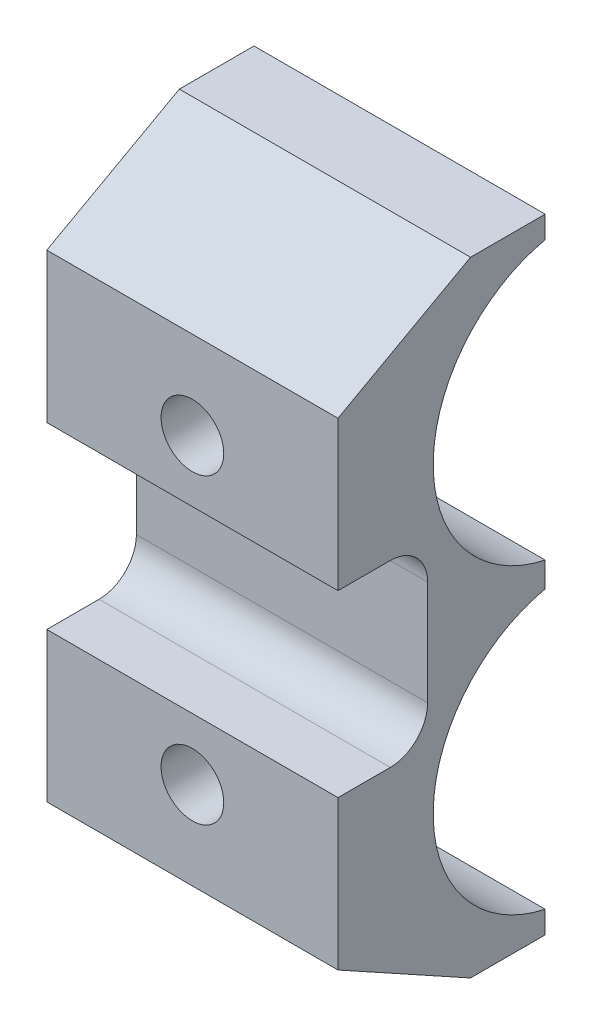
ISO-10303-21;
HEADER;
FILE_DESCRIPTION(('STEP AP214'),'2;1');
FILE_NAME('part.step','',(''),(''),'','','');
FILE_SCHEMA(('AUTOMOTIVE_DESIGN { 1 0 10303 214 1 1 1 1 }'));
ENDSEC;
DATA;
#1=APPLICATION_CONTEXT('core data for automotive mechanical design processes');
#2=APPLICATION_PROTOCOL_DEFINITION('international standard','automotive_design',2000,#1);
#3=PRODUCT_CONTEXT('',#1,'mechanical');
#4=PRODUCT('Part','Part','',(#3));
#5=PRODUCT_RELATED_PRODUCT_CATEGORY('part','',(#4));
#6=PRODUCT_DEFINITION_FORMATION('','',#4);
#7=PRODUCT_DEFINITION_CONTEXT('part definition',#1,'design');
#8=PRODUCT_DEFINITION('design','',#6,#7);
#9=PRODUCT_DEFINITION_SHAPE('','',#8);
#10=(LENGTH_UNIT() NAMED_UNIT(*) SI_UNIT(.MILLI.,.METRE.));
#11=(NAMED_UNIT(*) PLANE_ANGLE_UNIT() SI_UNIT($,.RADIAN.));
#12=(NAMED_UNIT(*) SI_UNIT($,.STERADIAN.) SOLID_ANGLE_UNIT());
#13=UNCERTAINTY_MEASURE_WITH_UNIT(LENGTH_MEASURE(1.E-05),#10,'distance_accuracy_value','');
#14=(GEOMETRIC_REPRESENTATION_CONTEXT(3) GLOBAL_UNCERTAINTY_ASSIGNED_CONTEXT((#13)) GLOBAL_UNIT_ASSIGNED_CONTEXT((#10,
#11,#12)) REPRESENTATION_CONTEXT('',''));
#15=CARTESIAN_POINT('',(0.,0.,0.));
#16=DIRECTION('',(0.,0.,1.));
#17=DIRECTION('',(1.,0.,0.));
#18=AXIS2_PLACEMENT_3D('',#15,#16,#17);
#19=CARTESIAN_POINT('',(9.75,-16.,15.875));
#20=DIRECTION('',(0.,0.,-1.));
#21=DIRECTION('',(-1.,0.,0.));
#22=AXIS2_PLACEMENT_3D('',#19,#20,#21);
#23=PLANE('',#22);
#24=CARTESIAN_POINT('',(0.,-10.125,15.875));
#25=DIRECTION('',(0.,0.,1.));
#26=DIRECTION('',(1.,0.,0.));
#27=AXIS2_PLACEMENT_3D('',#24,#25,#26);
#28=CIRCLE('',#27,2.1);
#29=CARTESIAN_POINT('',(2.1,-10.125,15.875));
#30=VERTEX_POINT('',#29);
#31=EDGE_CURVE('E253',#30,#30,#28,.T.);
#32=ORIENTED_EDGE('',*,*,#31,.F.);
#33=EDGE_LOOP('',(#32));
#34=FACE_BOUND('',#33,.T.);
#35=DIRECTION('',(0.,-1.,0.));
#36=VECTOR('',#35,1.);
#37=CARTESIAN_POINT('',(9.75,-16.,15.875));
#38=LINE('',#37,#36);
#39=CARTESIAN_POINT('',(9.75,-6.,15.875));
#40=VERTEX_POINT('',#39);
#41=CARTESIAN_POINT('',(9.75,-16.,15.875));
#42=VERTEX_POINT('',#41);
#43=EDGE_CURVE('E343',#40,#42,#38,.T.);
#44=ORIENTED_EDGE('',*,*,#43,.F.);
#45=DIRECTION('',(-1.,0.,0.));
#46=VECTOR('',#45,1.);
#47=CARTESIAN_POINT('',(9.75,-6.,15.875));
#48=LINE('',#47,#46);
#49=CARTESIAN_POINT('',(-9.75,-6.,15.875));
#50=VERTEX_POINT('',#49);
#51=EDGE_CURVE('E160',#40,#50,#48,.T.);
#52=ORIENTED_EDGE('',*,*,#51,.T.);
#53=DIRECTION('',(0.,-1.,0.));
#54=VECTOR('',#53,1.);
#55=CARTESIAN_POINT('',(-9.75,-16.,15.875));
#56=LINE('',#55,#54);
#57=CARTESIAN_POINT('',(-9.75,-16.,15.875));
#58=VERTEX_POINT('',#57);
#59=EDGE_CURVE('E155',#50,#58,#56,.T.);
#60=ORIENTED_EDGE('',*,*,#59,.T.);
#61=DIRECTION('',(-1.,0.,0.));
#62=VECTOR('',#61,1.);
#63=CARTESIAN_POINT('',(9.75,-16.,15.875));
#64=LINE('',#63,#62);
#65=EDGE_CURVE('E158',#42,#58,#64,.T.);
#66=ORIENTED_EDGE('',*,*,#65,.F.);
#67=EDGE_LOOP('',(#44,#52,#60,#66));
#68=FACE_BOUND('',#67,.T.);
#69=ADVANCED_FACE('F33',(#34,#68),#23,.F.);
#70=CARTESIAN_POINT('',(9.75,-16.,15.875));
#71=DIRECTION('',(0.,0.875433775843312,-0.483338084690955));
#72=DIRECTION('',(0.,0.483338084690956,0.875433775843313));
#73=AXIS2_PLACEMENT_3D('',#70,#71,#72);
#74=PLANE('',#73);
#75=DIRECTION('',(0.,-0.483338084690955,-0.875433775843312));
#76=VECTOR('',#75,1.);
#77=CARTESIAN_POINT('',(-9.75,-16.,15.875));
#78=LINE('',#77,#76);
#79=CARTESIAN_POINT('',(-9.75,-20.9,7.));
#80=VERTEX_POINT('',#79);
#81=EDGE_CURVE('E168',#58,#80,#78,.T.);
#82=ORIENTED_EDGE('',*,*,#81,.T.);
#83=DIRECTION('',(-1.,0.,0.));
#84=VECTOR('',#83,1.);
#85=CARTESIAN_POINT('',(9.75,-20.9,7.));
#86=LINE('',#85,#84);
#87=CARTESIAN_POINT('',(9.75,-20.9,7.));
#88=VERTEX_POINT('',#87);
#89=EDGE_CURVE('E222',#88,#80,#86,.T.);
#90=ORIENTED_EDGE('',*,*,#89,.F.);
#91=DIRECTION('',(0.,-0.483338084690955,-0.875433775843312));
#92=VECTOR('',#91,1.);
#93=CARTESIAN_POINT('',(9.75,-16.,15.875));
#94=LINE('',#93,#92);
#95=EDGE_CURVE('E170',#42,#88,#94,.T.);
#96=ORIENTED_EDGE('',*,*,#95,.F.);
#97=ORIENTED_EDGE('',*,*,#65,.T.);
#98=EDGE_LOOP('',(#82,#90,#96,#97));
#99=FACE_BOUND('',#98,.T.);
#100=ADVANCED_FACE('F35',(#99),#74,.F.);
#101=CARTESIAN_POINT('',(9.75,-20.9,7.));
#102=DIRECTION('',(0.,1.,0.));
#103=DIRECTION('',(0.,0.,1.));
#104=AXIS2_PLACEMENT_3D('',#101,#102,#103);
#105=PLANE('',#104);
#106=DIRECTION('',(0.,0.,-1.));
#107=VECTOR('',#106,1.);
#108=CARTESIAN_POINT('',(-9.75,-20.9,7.));
#109=LINE('',#108,#107);
#110=CARTESIAN_POINT('',(-9.75,-20.9,2.));
#111=VERTEX_POINT('',#110);
#112=EDGE_CURVE('E176',#80,#111,#109,.T.);
#113=ORIENTED_EDGE('',*,*,#112,.T.);
#114=DIRECTION('',(-1.,0.,0.));
#115=VECTOR('',#114,1.);
#116=CARTESIAN_POINT('',(9.75,-20.9,2.));
#117=LINE('',#116,#115);
#118=CARTESIAN_POINT('',(9.75,-20.9,2.));
#119=VERTEX_POINT('',#118);
#120=EDGE_CURVE('E219',#119,#111,#117,.T.);
#121=ORIENTED_EDGE('',*,*,#120,.F.);
#122=DIRECTION('',(0.,0.,-1.));
#123=VECTOR('',#122,1.);
#124=CARTESIAN_POINT('',(9.75,-20.9,7.));
#125=LINE('',#124,#123);
#126=EDGE_CURVE('E358',#88,#119,#125,.T.);
#127=ORIENTED_EDGE('',*,*,#126,.F.);
#128=ORIENTED_EDGE('',*,*,#89,.T.);
#129=EDGE_LOOP('',(#113,#121,#127,#128));
#130=FACE_BOUND('',#129,.T.);
#131=ADVANCED_FACE('F312',(#130),#105,.F.);
#132=CARTESIAN_POINT('',(9.75,-20.9,2.));
#133=DIRECTION('',(0.,0.,1.));
#134=DIRECTION('',(0.,-1.,0.));
#135=AXIS2_PLACEMENT_3D('',#132,#133,#134);
#136=PLANE('',#135);
#137=DIRECTION('',(0.,1.,0.));
#138=VECTOR('',#137,1.);
#139=CARTESIAN_POINT('',(-9.75,-20.9,2.));
#140=LINE('',#139,#138);
#141=CARTESIAN_POINT('',(-9.75,-19.4120878105034,2.));
#142=VERTEX_POINT('',#141);
#143=EDGE_CURVE('E180',#111,#142,#140,.T.);
#144=ORIENTED_EDGE('',*,*,#143,.T.);
#145=DIRECTION('',(-1.,0.,0.));
#146=VECTOR('',#145,1.);
#147=CARTESIAN_POINT('',(9.75,-19.4120878105034,2.));
#148=LINE('',#147,#146);
#149=CARTESIAN_POINT('',(9.75,-19.4120878105034,2.));
#150=VERTEX_POINT('',#149);
#151=EDGE_CURVE('E216',#150,#142,#148,.T.);
#152=ORIENTED_EDGE('',*,*,#151,.F.);
#153=DIRECTION('',(0.,1.,0.));
#154=VECTOR('',#153,1.);
#155=CARTESIAN_POINT('',(9.75,-20.9,2.));
#156=LINE('',#155,#154);
#157=EDGE_CURVE('E357',#119,#150,#156,.T.);
#158=ORIENTED_EDGE('',*,*,#157,.F.);
#159=ORIENTED_EDGE('',*,*,#120,.T.);
#160=EDGE_LOOP('',(#144,#152,#158,#159));
#161=FACE_BOUND('',#160,.T.);
#162=ADVANCED_FACE('F301',(#161),#136,.F.);
#163=CARTESIAN_POINT('',(9.75,-10.125,0.));
#164=DIRECTION('',(-1.,0.,0.));
#165=DIRECTION('',(0.,0.,1.));
#166=AXIS2_PLACEMENT_3D('',#163,#164,#165);
#167=CYLINDRICAL_SURFACE('',#166,9.5);
#168=CARTESIAN_POINT('',(2.1,-10.125,9.5));
#169=CARTESIAN_POINT('',(2.09999606715765,-10.0085596920723,9.49999785709729));
#170=CARTESIAN_POINT('',(2.09028277828364,-9.89207212984041,9.49783748384886));
#171=CARTESIAN_POINT('',(2.05172784260876,-9.66240789295682,9.4894280381436));
#172=CARTESIAN_POINT('',(2.02287272574585,-9.54923360845053,9.48317608649382));
#173=CARTESIAN_POINT('',(1.94698373436672,-9.32954806306881,9.46727932483978));
#174=CARTESIAN_POINT('',(1.89996905134314,-9.2230299054365,9.45763809767181));
#175=CARTESIAN_POINT('',(1.78915688551958,-9.01939697713897,9.43600237149338));
#176=CARTESIAN_POINT('',(1.72535976497756,-8.92228200356283,9.42400792327988));
#177=CARTESIAN_POINT('',(1.58168870929299,-8.73861907037091,9.39875937909973));
#178=CARTESIAN_POINT('',(1.50159262691729,-8.65224705725887,9.38548938349097));
#179=CARTESIAN_POINT('',(1.32807409975902,-8.49404770283157,9.35929692609845));
#180=CARTESIAN_POINT('',(1.23465044770762,-8.42222168058272,9.34637449592484));
#181=CARTESIAN_POINT('',(1.03582325817677,-8.29437332577055,9.32218329581774));
#182=CARTESIAN_POINT('',(0.930296152291522,-8.23853896708386,9.31093488695391));
#183=CARTESIAN_POINT('',(0.711067137800858,-8.14546484163014,9.29159379780658));
#184=CARTESIAN_POINT('',(0.597366231082767,-8.10822280037751,9.28350073154174));
#185=CARTESIAN_POINT('',(0.366927668155611,-8.05397328129699,9.27154869109911));
#186=CARTESIAN_POINT('',(0.250266884672186,-8.03665393691046,9.26762453435162));
#187=CARTESIAN_POINT('',(0.0156346151483341,-8.0217716103006,9.2642589010233));
#188=CARTESIAN_POINT('',(-0.102336704354329,-8.02420614587304,9.26481686123507));
#189=CARTESIAN_POINT('',(-0.333917866695424,-8.0485116506625,9.27029343657279));
#190=CARTESIAN_POINT('',(-0.44756801875287,-8.07001969057026,9.275130622727));
#191=CARTESIAN_POINT('',(-0.669605937040996,-8.13128640240636,9.28849180588077));
#192=CARTESIAN_POINT('',(-0.777993401983943,-8.17104611788024,9.2970160136854));
#193=CARTESIAN_POINT('',(-0.987446182906781,-8.2680190928007,9.31687062999741));
#194=CARTESIAN_POINT('',(-1.08844495272608,-8.3253713495681,9.32822324632103));
#195=CARTESIAN_POINT('',(-1.27951902636723,-8.45580369163111,9.35244198293865));
#196=CARTESIAN_POINT('',(-1.36959280835435,-8.52888596416974,9.3653083136002));
#197=CARTESIAN_POINT('',(-1.53834889007678,-8.69062207722818,9.39145369439784));
#198=CARTESIAN_POINT('',(-1.61673542548777,-8.77958437104705,9.40473558139056));
#199=CARTESIAN_POINT('',(-1.75752534135222,-8.96954292580126,9.42995676346728));
#200=CARTESIAN_POINT('',(-1.81992842014593,-9.07053941380822,9.44189603320935));
#201=CARTESIAN_POINT('',(-1.92705555482384,-9.28206470039705,9.46312681375453));
#202=CARTESIAN_POINT('',(-1.97174020742701,-9.39261408620509,9.47241241050783));
#203=CARTESIAN_POINT('',(-2.04181645968446,-9.61990343660546,9.48724573846241));
#204=CARTESIAN_POINT('',(-2.06721092622806,-9.73664247853697,9.49279402508532));
#205=CARTESIAN_POINT('',(-2.09755426397868,-9.97046095624298,9.49944831326327));
#206=CARTESIAN_POINT('',(-2.1029070612611,-10.0874855461996,9.50064206460397));
#207=CARTESIAN_POINT('',(-2.0941108495817,-10.3207568511187,9.4986989593362));
#208=CARTESIAN_POINT('',(-2.07996319314053,-10.4370036194677,9.495562403071));
#209=CARTESIAN_POINT('',(-2.03290249705699,-10.6640765497789,9.48536655052878));
#210=CARTESIAN_POINT('',(-2.00020191540127,-10.7749489158822,9.47835168931984));
#211=CARTESIAN_POINT('',(-1.91719991631618,-10.9896344886898,9.46118465966891));
#212=CARTESIAN_POINT('',(-1.8668969775111,-11.0934470842899,9.45103222005416));
#213=CARTESIAN_POINT('',(-1.7492807397568,-11.2927321025323,9.42850010733486));
#214=CARTESIAN_POINT('',(-1.68173092067501,-11.3880614403522,9.4160902184548));
#215=CARTESIAN_POINT('',(-1.53184921159322,-11.5661764808373,9.3904803693105));
#216=CARTESIAN_POINT('',(-1.44951535783065,-11.6489605144136,9.37728030424265));
#217=CARTESIAN_POINT('',(-1.2705474786429,-11.8012368046754,9.35127382345967));
#218=CARTESIAN_POINT('',(-1.17367313644392,-11.8704490763872,9.33847951939832));
#219=CARTESIAN_POINT('',(-0.969438808292507,-11.9916239008006,9.31501690397758));
#220=CARTESIAN_POINT('',(-0.862079279359842,-12.0435872049021,9.30434850001775));
#221=CARTESIAN_POINT('',(-0.640500516100298,-12.1284345252516,9.28644883260918));
#222=CARTESIAN_POINT('',(-0.526324316029969,-12.1614266238338,9.27919814138543));
#223=CARTESIAN_POINT('',(-0.293867326916637,-12.2077098961787,9.26892074912117));
#224=CARTESIAN_POINT('',(-0.1755872136829,-12.2210042980368,9.26589335596347));
#225=CARTESIAN_POINT('',(0.0588953606003005,-12.2273751375319,9.26444960483717));
#226=CARTESIAN_POINT('',(0.175085349730131,-12.2208957266634,9.26593194861283));
#227=CARTESIAN_POINT('',(0.404673806562934,-12.1888974557813,9.27311119600425));
#228=CARTESIAN_POINT('',(0.518072308611217,-12.1633788301396,9.27880804773963));
#229=CARTESIAN_POINT('',(0.738496894249019,-12.094243157095,9.29372452351939));
#230=CARTESIAN_POINT('',(0.845544591460207,-12.0506920640955,9.30293130025747));
#231=CARTESIAN_POINT('',(1.05087941131489,-11.946783886792,9.32383503234712));
#232=CARTESIAN_POINT('',(1.14916559738415,-11.8864250086329,9.33553225346652));
#233=CARTESIAN_POINT('',(1.33637393254247,-11.7491471513699,9.36040052943994));
#234=CARTESIAN_POINT('',(1.42506105616705,-11.6719122101185,9.37359701229712));
#235=CARTESIAN_POINT('',(1.58836150185076,-11.5037132764262,9.39980746067692));
#236=CARTESIAN_POINT('',(1.66297156179424,-11.4127461105498,9.41282138324922));
#237=CARTESIAN_POINT('',(1.79695225074567,-11.2182053117419,9.43740598211741));
#238=CARTESIAN_POINT('',(1.85610678389835,-11.1144799776431,9.44895513900801));
#239=CARTESIAN_POINT('',(1.95604768526871,-10.8983241338218,9.46909237502127));
#240=CARTESIAN_POINT('',(1.99684930443277,-10.7859009432624,9.47768291130886));
#241=CARTESIAN_POINT('',(2.05173818213111,-10.5819879294374,9.48942031323049));
#242=CARTESIAN_POINT('',(2.06980152400816,-10.4915930067546,9.49336293948738));
#243=CARTESIAN_POINT('',(2.09393371142421,-10.3091418562251,9.4986535703763));
#244=CARTESIAN_POINT('',(2.1000031102508,-10.2170857052095,9.50000169469413));
#245=CARTESIAN_POINT('',(2.1,-10.125,9.5));
#246=B_SPLINE_CURVE_WITH_KNOTS('',3,(#168,#169,#170,#171,#172,#173,#174,#175,#176,#177,#178,
#179,#180,#181,#182,#183,#184,#185,#186,#187,#188,#189,#190,#191,#192,#193,#194,#195,#196,#197,
#198,#199,#200,#201,#202,#203,#204,#205,#206,#207,#208,#209,#210,#211,#212,#213,#214,#215,#216,
#217,#218,#219,#220,#221,#222,#223,#224,#225,#226,#227,#228,#229,#230,#231,#232,#233,#234,#235,
#236,#237,#238,#239,#240,#241,#242,#243,#244,#245),.UNSPECIFIED.,.T.,.F.,(4,2,2,2,2,2,2,2,2,2,2,
2,2,2,2,2,2,2,2,2,2,2,2,2,2,2,2,2,2,2,2,2,2,2,2,2,2,2,4),(0.,0.348983826593803,
0.698213493210619,1.04707509039904,1.39592915783963,1.74990165295882,2.1039062328202,
2.46191554778973,2.81988105505783,3.17216332553392,3.52440133012415,3.87007743689001,
4.21577331026261,4.56427409671387,4.91282337319404,5.26907603377203,5.62533541749956,
5.98238268720982,6.3393768825031,6.68913613376488,7.03887112749838,7.38467972378605,
7.73051821577425,8.08138128733737,8.43229099854653,8.78981578433887,9.14732499358149,
9.50277669750311,9.85817014289103,10.2056400879585,10.5531057557594,10.8993116268792,
11.2455544619018,11.5989406758402,11.952408680602,12.3105821940723,12.6684575193393,
12.9444607773644,13.2204513029008),.UNSPECIFIED.);
#247=CARTESIAN_POINT('',(2.1,-10.125,9.5));
#248=VERTEX_POINT('',#247);
#249=EDGE_CURVE('E256',#248,#248,#246,.T.);
#250=ORIENTED_EDGE('',*,*,#249,.T.);
#251=EDGE_LOOP('',(#250));
#252=FACE_BOUND('',#251,.T.);
#253=CARTESIAN_POINT('',(-9.75,-10.125,0.));
#254=DIRECTION('',(-1.,0.,0.));
#255=DIRECTION('',(0.,0.,-1.));
#256=AXIS2_PLACEMENT_3D('',#253,#254,#255);
#257=CIRCLE('',#256,9.5);
#258=CARTESIAN_POINT('',(-9.75,-0.837912189496645,2.));
#259=VERTEX_POINT('',#258);
#260=EDGE_CURVE('E189',#142,#259,#257,.T.);
#261=ORIENTED_EDGE('',*,*,#260,.T.);
#262=DIRECTION('',(-1.,0.,0.));
#263=VECTOR('',#262,1.);
#264=CARTESIAN_POINT('',(9.75,-0.837912189496645,2.));
#265=LINE('',#264,#263);
#266=CARTESIAN_POINT('',(9.75,-0.837912189496645,2.));
#267=VERTEX_POINT('',#266);
#268=EDGE_CURVE('E213',#267,#259,#265,.T.);
#269=ORIENTED_EDGE('',*,*,#268,.F.);
#270=CARTESIAN_POINT('',(9.75,-10.125,0.));
#271=DIRECTION('',(-1.,0.,0.));
#272=DIRECTION('',(0.,0.,-1.));
#273=AXIS2_PLACEMENT_3D('',#270,#271,#272);
#274=CIRCLE('',#273,9.5);
#275=EDGE_CURVE('E355',#150,#267,#274,.T.);
#276=ORIENTED_EDGE('',*,*,#275,.F.);
#277=ORIENTED_EDGE('',*,*,#151,.T.);
#278=EDGE_LOOP('',(#261,#269,#276,#277));
#279=FACE_BOUND('',#278,.T.);
#280=ADVANCED_FACE('F263',(#252,#279),#167,.F.);
#281=CARTESIAN_POINT('',(9.75,-0.837912189496645,2.));
#282=DIRECTION('',(0.,0.,1.));
#283=DIRECTION('',(0.,-1.,0.));
#284=AXIS2_PLACEMENT_3D('',#281,#282,#283);
#285=PLANE('',#284);
#286=DIRECTION('',(0.,1.,0.));
#287=VECTOR('',#286,1.);
#288=CARTESIAN_POINT('',(-9.75,-0.837912189496645,2.));
#289=LINE('',#288,#287);
#290=CARTESIAN_POINT('',(-9.75,0.837912189496647,2.));
#291=VERTEX_POINT('',#290);
#292=EDGE_CURVE('E191',#259,#291,#289,.T.);
#293=ORIENTED_EDGE('',*,*,#292,.T.);
#294=DIRECTION('',(-1.,0.,0.));
#295=VECTOR('',#294,1.);
#296=CARTESIAN_POINT('',(9.75,0.837912189496647,2.));
#297=LINE('',#296,#295);
#298=CARTESIAN_POINT('',(9.75,0.837912189496647,2.));
#299=VERTEX_POINT('',#298);
#300=EDGE_CURVE('E210',#299,#291,#297,.T.);
#301=ORIENTED_EDGE('',*,*,#300,.F.);
#302=DIRECTION('',(0.,1.,0.));
#303=VECTOR('',#302,1.);
#304=CARTESIAN_POINT('',(9.75,-0.837912189496645,2.));
#305=LINE('',#304,#303);
#306=EDGE_CURVE('E353',#267,#299,#305,.T.);
#307=ORIENTED_EDGE('',*,*,#306,.F.);
#308=ORIENTED_EDGE('',*,*,#268,.T.);
#309=EDGE_LOOP('',(#293,#301,#307,#308));
#310=FACE_BOUND('',#309,.T.);
#311=ADVANCED_FACE('F293',(#310),#285,.F.);
#312=CARTESIAN_POINT('',(9.75,10.125,0.));
#313=DIRECTION('',(-1.,0.,0.));
#314=DIRECTION('',(0.,0.,1.));
#315=AXIS2_PLACEMENT_3D('',#312,#313,#314);
#316=CYLINDRICAL_SURFACE('',#315,9.5);
#317=CARTESIAN_POINT('',(2.1,10.125,9.5));
#318=CARTESIAN_POINT('',(2.09999606715765,10.2414403079277,9.49999785709729));
#319=CARTESIAN_POINT('',(2.09028277828364,10.3579278701596,9.49783748384886));
#320=CARTESIAN_POINT('',(2.05172784260876,10.5875921070432,9.4894280381436));
#321=CARTESIAN_POINT('',(2.02287272574585,10.7007663915495,9.48317608649382));
#322=CARTESIAN_POINT('',(1.94698373436672,10.9204519369312,9.46727932483978));
#323=CARTESIAN_POINT('',(1.89996905134314,11.0269700945635,9.45763809767181));
#324=CARTESIAN_POINT('',(1.78915688551958,11.230603022861,9.43600237149338));
#325=CARTESIAN_POINT('',(1.72535976497756,11.3277179964372,9.42400792327988));
#326=CARTESIAN_POINT('',(1.58168870929299,11.5113809296291,9.39875937909973));
#327=CARTESIAN_POINT('',(1.50159262691729,11.5977529427411,9.38548938349097));
#328=CARTESIAN_POINT('',(1.32807409975902,11.7559522971684,9.35929692609845));
#329=CARTESIAN_POINT('',(1.23465044770763,11.8277783194173,9.34637449592484));
#330=CARTESIAN_POINT('',(1.03582325817677,11.9556266742295,9.32218329581774));
#331=CARTESIAN_POINT('',(0.930296152291523,12.0114610329161,9.31093488695391));
#332=CARTESIAN_POINT('',(0.711067137800858,12.1045351583699,9.29159379780658));
#333=CARTESIAN_POINT('',(0.597366231082767,12.1417771996225,9.28350073154174));
#334=CARTESIAN_POINT('',(0.366927668155611,12.196026718703,9.27154869109911));
#335=CARTESIAN_POINT('',(0.250266884672186,12.2133460630895,9.26762453435162));
#336=CARTESIAN_POINT('',(0.0156346151483341,12.2282283896994,9.2642589010233));
#337=CARTESIAN_POINT('',(-0.102336704354329,12.225793854127,9.26481686123507));
#338=CARTESIAN_POINT('',(-0.333917866695424,12.2014883493375,9.27029343657279));
#339=CARTESIAN_POINT('',(-0.44756801875287,12.1799803094297,9.275130622727));
#340=CARTESIAN_POINT('',(-0.669605937040996,12.1187135975936,9.28849180588077));
#341=CARTESIAN_POINT('',(-0.777993401983943,12.0789538821198,9.2970160136854));
#342=CARTESIAN_POINT('',(-0.987446182906781,11.9819809071993,9.31687062999741));
#343=CARTESIAN_POINT('',(-1.08844495272608,11.9246286504319,9.32822324632103));
#344=CARTESIAN_POINT('',(-1.27951902636723,11.7941963083689,9.35244198293865));
#345=CARTESIAN_POINT('',(-1.36959280835435,11.7211140358303,9.3653083136002));
#346=CARTESIAN_POINT('',(-1.53834889007678,11.5593779227718,9.39145369439784));
#347=CARTESIAN_POINT('',(-1.61673542548777,11.4704156289529,9.40473558139056));
#348=CARTESIAN_POINT('',(-1.75752534135222,11.2804570741987,9.42995676346728));
#349=CARTESIAN_POINT('',(-1.81992842014593,11.1794605861918,9.44189603320935));
#350=CARTESIAN_POINT('',(-1.92705555482384,10.9679352996029,9.46312681375453));
#351=CARTESIAN_POINT('',(-1.97174020742701,10.8573859137949,9.47241241050783));
#352=CARTESIAN_POINT('',(-2.04181645968446,10.6300965633945,9.48724573846241));
#353=CARTESIAN_POINT('',(-2.06721092622806,10.513357521463,9.49279402508532));
#354=CARTESIAN_POINT('',(-2.09755426397868,10.279539043757,9.49944831326327));
#355=CARTESIAN_POINT('',(-2.1029070612611,10.1625144538004,9.50064206460397));
#356=CARTESIAN_POINT('',(-2.0941108495817,9.92924314888132,9.4986989593362));
#357=CARTESIAN_POINT('',(-2.07996319314053,9.81299638053234,9.495562403071));
#358=CARTESIAN_POINT('',(-2.03290249705699,9.58592345022112,9.48536655052878));
#359=CARTESIAN_POINT('',(-2.00020191540127,9.4750510841178,9.47835168931984));
#360=CARTESIAN_POINT('',(-1.91719991631618,9.2603655113102,9.46118465966891));
#361=CARTESIAN_POINT('',(-1.8668969775111,9.15655291571006,9.45103222005416));
#362=CARTESIAN_POINT('',(-1.7492807397568,8.95726789746768,9.42850010733486));
#363=CARTESIAN_POINT('',(-1.68173092067501,8.86193855964783,9.4160902184548));
#364=CARTESIAN_POINT('',(-1.53184921159322,8.68382351916267,9.3904803693105));
#365=CARTESIAN_POINT('',(-1.44951535783065,8.60103948558644,9.37728030424265));
#366=CARTESIAN_POINT('',(-1.2705474786429,8.4487631953246,9.35127382345967));
#367=CARTESIAN_POINT('',(-1.17367313644392,8.37955092361276,9.33847951939832));
#368=CARTESIAN_POINT('',(-0.969438808292507,8.25837609919942,9.31501690397758));
#369=CARTESIAN_POINT('',(-0.862079279359842,8.20641279509788,9.30434850001775));
#370=CARTESIAN_POINT('',(-0.640500516100298,8.12156547474838,9.28644883260918));
#371=CARTESIAN_POINT('',(-0.526324316029969,8.0885733761662,9.27919814138543));
#372=CARTESIAN_POINT('',(-0.293867326916637,8.04229010382126,9.26892074912117));
#373=CARTESIAN_POINT('',(-0.1755872136829,8.02899570196322,9.26589335596347));
#374=CARTESIAN_POINT('',(0.0588953606003005,8.02262486246806,9.26444960483717));
#375=CARTESIAN_POINT('',(0.175085349730132,8.02910427333659,9.26593194861283));
#376=CARTESIAN_POINT('',(0.404673806562934,8.06110254421865,9.27311119600425));
#377=CARTESIAN_POINT('',(0.518072308611217,8.08662116986044,9.27880804773963));
#378=CARTESIAN_POINT('',(0.73849689424902,8.15575684290503,9.29372452351939));
#379=CARTESIAN_POINT('',(0.845544591460208,8.19930793590452,9.30293130025747));
#380=CARTESIAN_POINT('',(1.05087941131489,8.303216113208,9.32383503234712));
#381=CARTESIAN_POINT('',(1.14916559738415,8.36357499136707,9.33553225346652));
#382=CARTESIAN_POINT('',(1.33637393254247,8.50085284863007,9.36040052943994));
#383=CARTESIAN_POINT('',(1.42506105616705,8.57808778988145,9.37359701229712));
#384=CARTESIAN_POINT('',(1.58836150185076,8.74628672357381,9.39980746067692));
#385=CARTESIAN_POINT('',(1.66297156179424,8.83725388945017,9.41282138324922));
#386=CARTESIAN_POINT('',(1.79695225074567,9.03179468825808,9.43740598211741));
#387=CARTESIAN_POINT('',(1.85610678389835,9.13552002235687,9.44895513900801));
#388=CARTESIAN_POINT('',(1.95604768526871,9.3516758661782,9.46909237502127));
#389=CARTESIAN_POINT('',(1.99684930443277,9.46409905673758,9.47768291130886));
#390=CARTESIAN_POINT('',(2.05173818213111,9.66801207056256,9.48942031323049));
#391=CARTESIAN_POINT('',(2.06980152400816,9.7584069932454,9.49336293948738));
#392=CARTESIAN_POINT('',(2.09393371142421,9.94085814377495,9.4986535703763));
#393=CARTESIAN_POINT('',(2.1000031102508,10.0329142947905,9.50000169469413));
#394=CARTESIAN_POINT('',(2.1,10.125,9.5));
#395=B_SPLINE_CURVE_WITH_KNOTS('',3,(#317,#318,#319,#320,#321,#322,#323,#324,#325,#326,#327,
#328,#329,#330,#331,#332,#333,#334,#335,#336,#337,#338,#339,#340,#341,#342,#343,#344,#345,#346,
#347,#348,#349,#350,#351,#352,#353,#354,#355,#356,#357,#358,#359,#360,#361,#362,#363,#364,#365,
#366,#367,#368,#369,#370,#371,#372,#373,#374,#375,#376,#377,#378,#379,#380,#381,#382,#383,#384,
#385,#386,#387,#388,#389,#390,#391,#392,#393,#394),.UNSPECIFIED.,.T.,.F.,(4,2,2,2,2,2,2,2,2,2,2,
2,2,2,2,2,2,2,2,2,2,2,2,2,2,2,2,2,2,2,2,2,2,2,2,2,2,2,4),(0.,0.348983826593803,
0.698213493210619,1.04707509039903,1.39592915783963,1.74990165295882,2.1039062328202,
2.46191554778973,2.81988105505783,3.17216332553392,3.52440133012415,3.87007743689001,
4.21577331026261,4.56427409671387,4.91282337319404,5.26907603377203,5.62533541749956,
5.98238268720982,6.3393768825031,6.68913613376488,7.03887112749838,7.38467972378605,
7.73051821577425,8.08138128733737,8.43229099854653,8.78981578433887,9.14732499358149,
9.50277669750311,9.85817014289103,10.2056400879585,10.5531057557594,10.8993116268792,
11.2455544619018,11.5989406758403,11.952408680602,12.3105821940723,12.6684575193393,
12.9444607773644,13.2204513029008),.UNSPECIFIED.);
#396=CARTESIAN_POINT('',(2.1,10.125,9.5));
#397=VERTEX_POINT('',#396);
#398=EDGE_CURVE('E178',#397,#397,#395,.T.);
#399=ORIENTED_EDGE('',*,*,#398,.T.);
#400=EDGE_LOOP('',(#399));
#401=FACE_BOUND('',#400,.T.);
#402=CARTESIAN_POINT('',(-9.75,10.125,0.));
#403=DIRECTION('',(-1.,0.,0.));
#404=DIRECTION('',(0.,0.,-1.));
#405=AXIS2_PLACEMENT_3D('',#402,#403,#404);
#406=CIRCLE('',#405,9.5);
#407=CARTESIAN_POINT('',(-9.75,19.4120878105034,2.));
#408=VERTEX_POINT('',#407);
#409=EDGE_CURVE('E193',#291,#408,#406,.T.);
#410=ORIENTED_EDGE('',*,*,#409,.T.);
#411=DIRECTION('',(-1.,0.,0.));
#412=VECTOR('',#411,1.);
#413=CARTESIAN_POINT('',(9.75,19.4120878105034,2.));
#414=LINE('',#413,#412);
#415=CARTESIAN_POINT('',(9.75,19.4120878105034,2.));
#416=VERTEX_POINT('',#415);
#417=EDGE_CURVE('E207',#416,#408,#414,.T.);
#418=ORIENTED_EDGE('',*,*,#417,.F.);
#419=CARTESIAN_POINT('',(9.75,10.125,0.));
#420=DIRECTION('',(-1.,0.,0.));
#421=DIRECTION('',(0.,0.,-1.));
#422=AXIS2_PLACEMENT_3D('',#419,#420,#421);
#423=CIRCLE('',#422,9.5);
#424=EDGE_CURVE('E351',#299,#416,#423,.T.);
#425=ORIENTED_EDGE('',*,*,#424,.F.);
#426=ORIENTED_EDGE('',*,*,#300,.T.);
#427=EDGE_LOOP('',(#410,#418,#425,#426));
#428=FACE_BOUND('',#427,.T.);
#429=ADVANCED_FACE('F288',(#401,#428),#316,.F.);
#430=CARTESIAN_POINT('',(9.75,19.4120878105034,2.));
#431=DIRECTION('',(0.,0.,1.));
#432=DIRECTION('',(0.,-1.,0.));
#433=AXIS2_PLACEMENT_3D('',#430,#431,#432);
#434=PLANE('',#433);
#435=DIRECTION('',(0.,1.,0.));
#436=VECTOR('',#435,1.);
#437=CARTESIAN_POINT('',(-9.75,19.4120878105034,2.));
#438=LINE('',#437,#436);
#439=CARTESIAN_POINT('',(-9.75,20.9,2.));
#440=VERTEX_POINT('',#439);
#441=EDGE_CURVE('E195',#408,#440,#438,.T.);
#442=ORIENTED_EDGE('',*,*,#441,.T.);
#443=DIRECTION('',(-1.,0.,0.));
#444=VECTOR('',#443,1.);
#445=CARTESIAN_POINT('',(9.75,20.9,2.));
#446=LINE('',#445,#444);
#447=CARTESIAN_POINT('',(9.75,20.9,2.));
#448=VERTEX_POINT('',#447);
#449=EDGE_CURVE('E204',#448,#440,#446,.T.);
#450=ORIENTED_EDGE('',*,*,#449,.F.);
#451=DIRECTION('',(0.,1.,0.));
#452=VECTOR('',#451,1.);
#453=CARTESIAN_POINT('',(9.75,19.4120878105034,2.));
#454=LINE('',#453,#452);
#455=EDGE_CURVE('E347',#416,#448,#454,.T.);
#456=ORIENTED_EDGE('',*,*,#455,.F.);
#457=ORIENTED_EDGE('',*,*,#417,.T.);
#458=EDGE_LOOP('',(#442,#450,#456,#457));
#459=FACE_BOUND('',#458,.T.);
#460=ADVANCED_FACE('F292',(#459),#434,.F.);
#461=CARTESIAN_POINT('',(9.75,20.9,7.));
#462=DIRECTION('',(0.,-1.,0.));
#463=DIRECTION('',(0.,0.,-1.));
#464=AXIS2_PLACEMENT_3D('',#461,#462,#463);
#465=PLANE('',#464);
#466=DIRECTION('',(0.,0.,1.));
#467=VECTOR('',#466,1.);
#468=CARTESIAN_POINT('',(-9.75,20.9,7.));
#469=LINE('',#468,#467);
#470=CARTESIAN_POINT('',(-9.75,20.9,7.));
#471=VERTEX_POINT('',#470);
#472=EDGE_CURVE('E197',#440,#471,#469,.T.);
#473=ORIENTED_EDGE('',*,*,#472,.T.);
#474=DIRECTION('',(-1.,0.,0.));
#475=VECTOR('',#474,1.);
#476=CARTESIAN_POINT('',(9.75,20.9,7.));
#477=LINE('',#476,#475);
#478=CARTESIAN_POINT('',(9.75,20.9,7.));
#479=VERTEX_POINT('',#478);
#480=EDGE_CURVE('E202',#479,#471,#477,.T.);
#481=ORIENTED_EDGE('',*,*,#480,.F.);
#482=DIRECTION('',(0.,0.,1.));
#483=VECTOR('',#482,1.);
#484=CARTESIAN_POINT('',(9.75,20.9,7.));
#485=LINE('',#484,#483);
#486=EDGE_CURVE('E345',#448,#479,#485,.T.);
#487=ORIENTED_EDGE('',*,*,#486,.F.);
#488=ORIENTED_EDGE('',*,*,#449,.T.);
#489=EDGE_LOOP('',(#473,#481,#487,#488));
#490=FACE_BOUND('',#489,.T.);
#491=ADVANCED_FACE('F322',(#490),#465,.F.);
#492=CARTESIAN_POINT('',(9.75,16.,15.875));
#493=DIRECTION('',(0.,-0.875433775843312,-0.483338084690955));
#494=DIRECTION('',(0.,0.483338084690956,-0.875433775843313));
#495=AXIS2_PLACEMENT_3D('',#492,#493,#494);
#496=PLANE('',#495);
#497=DIRECTION('',(0.,-0.483338084690955,0.875433775843312));
#498=VECTOR('',#497,1.);
#499=CARTESIAN_POINT('',(-9.75,16.,15.875));
#500=LINE('',#499,#498);
#501=CARTESIAN_POINT('',(-9.75,16.,15.875));
#502=VERTEX_POINT('',#501);
#503=EDGE_CURVE('E148',#471,#502,#500,.T.);
#504=ORIENTED_EDGE('',*,*,#503,.T.);
#505=DIRECTION('',(-1.,0.,0.));
#506=VECTOR('',#505,1.);
#507=CARTESIAN_POINT('',(9.75,16.,15.875));
#508=LINE('',#507,#506);
#509=CARTESIAN_POINT('',(9.75,16.,15.875));
#510=VERTEX_POINT('',#509);
#511=EDGE_CURVE('E171',#510,#502,#508,.T.);
#512=ORIENTED_EDGE('',*,*,#511,.F.);
#513=DIRECTION('',(0.,-0.483338084690955,0.875433775843312));
#514=VECTOR('',#513,1.);
#515=CARTESIAN_POINT('',(9.75,16.,15.875));
#516=LINE('',#515,#514);
#517=EDGE_CURVE('E344',#479,#510,#516,.T.);
#518=ORIENTED_EDGE('',*,*,#517,.F.);
#519=ORIENTED_EDGE('',*,*,#480,.T.);
#520=EDGE_LOOP('',(#504,#512,#518,#519));
#521=FACE_BOUND('',#520,.T.);
#522=ADVANCED_FACE('F315',(#521),#496,.F.);
#523=CARTESIAN_POINT('',(0.,10.125,15.875));
#524=DIRECTION('',(0.,0.,1.));
#525=DIRECTION('',(1.,0.,0.));
#526=AXIS2_PLACEMENT_3D('',#523,#524,#525);
#527=CIRCLE('',#526,2.1);
#528=CARTESIAN_POINT('',(2.1,10.125,15.875));
#529=VERTEX_POINT('',#528);
#530=EDGE_CURVE('E183',#529,#529,#527,.T.);
#531=ORIENTED_EDGE('',*,*,#530,.F.);
#532=EDGE_LOOP('',(#531));
#533=FACE_BOUND('',#532,.T.);
#534=CARTESIAN_POINT('',(-9.75,6.00000000000001,15.875));
#535=VERTEX_POINT('',#534);
#536=EDGE_CURVE('E163',#502,#535,#56,.T.);
#537=ORIENTED_EDGE('',*,*,#536,.T.);
#538=DIRECTION('',(-1.,0.,0.));
#539=VECTOR('',#538,1.);
#540=CARTESIAN_POINT('',(9.75,6.,15.875));
#541=LINE('',#540,#539);
#542=CARTESIAN_POINT('',(9.75,6.,15.875));
#543=VERTEX_POINT('',#542);
#544=EDGE_CURVE('E51',#543,#535,#541,.T.);
#545=ORIENTED_EDGE('',*,*,#544,.F.);
#546=EDGE_CURVE('E172',#510,#543,#38,.T.);
#547=ORIENTED_EDGE('',*,*,#546,.F.);
#548=ORIENTED_EDGE('',*,*,#511,.T.);
#549=EDGE_LOOP('',(#537,#545,#547,#548));
#550=FACE_BOUND('',#549,.T.);
#551=ADVANCED_FACE('F306',(#533,#550),#23,.F.);
#552=CARTESIAN_POINT('',(9.75,-10.125,0.));
#553=DIRECTION('',(1.,0.,0.));
#554=DIRECTION('',(0.,0.,-1.));
#555=AXIS2_PLACEMENT_3D('',#552,#553,#554);
#556=PLANE('',#555);
#557=DIRECTION('',(0.,0.,1.));
#558=VECTOR('',#557,1.);
#559=CARTESIAN_POINT('',(9.75,-6.,15.875));
#560=LINE('',#559,#558);
#561=CARTESIAN_POINT('',(9.75,-6.,12.375));
#562=VERTEX_POINT('',#561);
#563=EDGE_CURVE('E342',#562,#40,#560,.T.);
#564=ORIENTED_EDGE('',*,*,#563,.T.);
#565=ORIENTED_EDGE('',*,*,#43,.T.);
#566=ORIENTED_EDGE('',*,*,#95,.T.);
#567=ORIENTED_EDGE('',*,*,#126,.T.);
#568=ORIENTED_EDGE('',*,*,#157,.T.);
#569=ORIENTED_EDGE('',*,*,#275,.T.);
#570=ORIENTED_EDGE('',*,*,#306,.T.);
#571=ORIENTED_EDGE('',*,*,#424,.T.);
#572=ORIENTED_EDGE('',*,*,#455,.T.);
#573=ORIENTED_EDGE('',*,*,#486,.T.);
#574=ORIENTED_EDGE('',*,*,#517,.T.);
#575=ORIENTED_EDGE('',*,*,#546,.T.);
#576=DIRECTION('',(0.,0.,-1.));
#577=VECTOR('',#576,1.);
#578=CARTESIAN_POINT('',(9.75,6.,15.875));
#579=LINE('',#578,#577);
#580=CARTESIAN_POINT('',(9.75,6.,12.375));
#581=VERTEX_POINT('',#580);
#582=EDGE_CURVE('E78',#543,#581,#579,.T.);
#583=ORIENTED_EDGE('',*,*,#582,.T.);
#584=CARTESIAN_POINT('',(9.75,3.5,12.375));
#585=DIRECTION('',(-1.,0.,0.));
#586=DIRECTION('',(0.,0.,1.));
#587=AXIS2_PLACEMENT_3D('',#584,#585,#586);
#588=CIRCLE('',#587,2.5);
#589=CARTESIAN_POINT('',(9.75,3.5,9.875));
#590=VERTEX_POINT('',#589);
#591=EDGE_CURVE('E334',#581,#590,#588,.T.);
#592=ORIENTED_EDGE('',*,*,#591,.T.);
#593=DIRECTION('',(0.,-1.,0.));
#594=VECTOR('',#593,1.);
#595=CARTESIAN_POINT('',(9.75,3.5,9.87500000000001));
#596=LINE('',#595,#594);
#597=CARTESIAN_POINT('',(9.75,-3.5,9.87500000000001));
#598=VERTEX_POINT('',#597);
#599=EDGE_CURVE('E335',#590,#598,#596,.T.);
#600=ORIENTED_EDGE('',*,*,#599,.T.);
#601=CARTESIAN_POINT('',(9.75,-3.5,12.375));
#602=DIRECTION('',(-1.,0.,0.));
#603=DIRECTION('',(0.,0.,-1.));
#604=AXIS2_PLACEMENT_3D('',#601,#602,#603);
#605=CIRCLE('',#604,2.5);
#606=EDGE_CURVE('E238',#598,#562,#605,.T.);
#607=ORIENTED_EDGE('',*,*,#606,.T.);
#608=EDGE_LOOP('',(#564,#565,#566,#567,#568,#569,#570,#571,#572,#573,#574,#575,#583,#592,#600,#607));
#609=FACE_BOUND('',#608,.T.);
#610=ADVANCED_FACE('F281',(#609),#556,.T.);
#611=CARTESIAN_POINT('',(-9.75,-10.125,0.));
#612=DIRECTION('',(1.,0.,0.));
#613=DIRECTION('',(0.,0.,-1.));
#614=AXIS2_PLACEMENT_3D('',#611,#612,#613);
#615=PLANE('',#614);
#616=ORIENTED_EDGE('',*,*,#59,.F.);
#617=DIRECTION('',(0.,0.,-1.));
#618=VECTOR('',#617,1.);
#619=CARTESIAN_POINT('',(-9.75,-6.00000000000002,0.));
#620=LINE('',#619,#618);
#621=CARTESIAN_POINT('',(-9.75,-6.,12.375));
#622=VERTEX_POINT('',#621);
#623=EDGE_CURVE('E11',#50,#622,#620,.T.);
#624=ORIENTED_EDGE('',*,*,#623,.T.);
#625=CARTESIAN_POINT('',(-9.75,-3.5,12.375));
#626=DIRECTION('',(-1.,0.,0.));
#627=DIRECTION('',(0.,0.,1.));
#628=AXIS2_PLACEMENT_3D('',#625,#626,#627);
#629=CIRCLE('',#628,2.5);
#630=CARTESIAN_POINT('',(-9.75,-3.5,9.87500000000001));
#631=VERTEX_POINT('',#630);
#632=EDGE_CURVE('E37',#622,#631,#629,.F.);
#633=ORIENTED_EDGE('',*,*,#632,.T.);
#634=DIRECTION('',(0.,1.,0.));
#635=VECTOR('',#634,1.);
#636=CARTESIAN_POINT('',(-9.75,-10.125,9.87500000000001));
#637=LINE('',#636,#635);
#638=CARTESIAN_POINT('',(-9.75,3.5,9.87500000000001));
#639=VERTEX_POINT('',#638);
#640=EDGE_CURVE('E228',#631,#639,#637,.T.);
#641=ORIENTED_EDGE('',*,*,#640,.T.);
#642=CARTESIAN_POINT('',(-9.75,3.5,12.375));
#643=DIRECTION('',(-1.,0.,0.));
#644=DIRECTION('',(0.,0.,1.));
#645=AXIS2_PLACEMENT_3D('',#642,#643,#644);
#646=CIRCLE('',#645,2.5);
#647=CARTESIAN_POINT('',(-9.75,6.,12.375));
#648=VERTEX_POINT('',#647);
#649=EDGE_CURVE('E225',#639,#648,#646,.F.);
#650=ORIENTED_EDGE('',*,*,#649,.T.);
#651=DIRECTION('',(0.,0.,1.));
#652=VECTOR('',#651,1.);
#653=CARTESIAN_POINT('',(-9.75,6.00000000000002,0.));
#654=LINE('',#653,#652);
#655=EDGE_CURVE('E224',#648,#535,#654,.T.);
#656=ORIENTED_EDGE('',*,*,#655,.T.);
#657=ORIENTED_EDGE('',*,*,#536,.F.);
#658=ORIENTED_EDGE('',*,*,#503,.F.);
#659=ORIENTED_EDGE('',*,*,#472,.F.);
#660=ORIENTED_EDGE('',*,*,#441,.F.);
#661=ORIENTED_EDGE('',*,*,#409,.F.);
#662=ORIENTED_EDGE('',*,*,#292,.F.);
#663=ORIENTED_EDGE('',*,*,#260,.F.);
#664=ORIENTED_EDGE('',*,*,#143,.F.);
#665=ORIENTED_EDGE('',*,*,#112,.F.);
#666=ORIENTED_EDGE('',*,*,#81,.F.);
#667=EDGE_LOOP('',(#616,#624,#633,#641,#650,#656,#657,#658,#659,#660,#661,#662,#663,#664,#665,#666));
#668=FACE_BOUND('',#667,.T.);
#669=ADVANCED_FACE('F174',(#668),#615,.F.);
#670=CARTESIAN_POINT('',(0.,10.125,2.));
#671=DIRECTION('',(0.,0.,1.));
#672=DIRECTION('',(1.,0.,0.));
#673=AXIS2_PLACEMENT_3D('',#670,#671,#672);
#674=CYLINDRICAL_SURFACE('',#673,2.1);
#675=ORIENTED_EDGE('',*,*,#530,.T.);
#676=EDGE_LOOP('',(#675));
#677=FACE_BOUND('',#676,.T.);
#678=ORIENTED_EDGE('',*,*,#398,.F.);
#679=EDGE_LOOP('',(#678));
#680=FACE_BOUND('',#679,.T.);
#681=ADVANCED_FACE('F273',(#677,#680),#674,.F.);
#682=CARTESIAN_POINT('',(0.,-10.125,2.));
#683=DIRECTION('',(0.,0.,1.));
#684=DIRECTION('',(1.,0.,0.));
#685=AXIS2_PLACEMENT_3D('',#682,#683,#684);
#686=CYLINDRICAL_SURFACE('',#685,2.1);
#687=ORIENTED_EDGE('',*,*,#31,.T.);
#688=EDGE_LOOP('',(#687));
#689=FACE_BOUND('',#688,.T.);
#690=ORIENTED_EDGE('',*,*,#249,.F.);
#691=EDGE_LOOP('',(#690));
#692=FACE_BOUND('',#691,.T.);
#693=ADVANCED_FACE('F267',(#689,#692),#686,.F.);
#694=CARTESIAN_POINT('',(9.75,-6.,15.875));
#695=DIRECTION('',(0.,-1.,0.));
#696=DIRECTION('',(0.,0.,-1.));
#697=AXIS2_PLACEMENT_3D('',#694,#695,#696);
#698=PLANE('',#697);
#699=ORIENTED_EDGE('',*,*,#51,.F.);
#700=ORIENTED_EDGE('',*,*,#563,.F.);
#701=DIRECTION('',(-1.,0.,0.));
#702=VECTOR('',#701,1.);
#703=CARTESIAN_POINT('',(9.75,-6.,12.375));
#704=LINE('',#703,#702);
#705=EDGE_CURVE('E72',#562,#622,#704,.T.);
#706=ORIENTED_EDGE('',*,*,#705,.T.);
#707=ORIENTED_EDGE('',*,*,#623,.F.);
#708=EDGE_LOOP('',(#699,#700,#706,#707));
#709=FACE_BOUND('',#708,.T.);
#710=ADVANCED_FACE('F272',(#709),#698,.F.);
#711=CARTESIAN_POINT('',(9.75,-3.5,12.375));
#712=DIRECTION('',(-1.,0.,0.));
#713=DIRECTION('',(0.,0.,1.));
#714=AXIS2_PLACEMENT_3D('',#711,#712,#713);
#715=CYLINDRICAL_SURFACE('',#714,2.5);
#716=ORIENTED_EDGE('',*,*,#705,.F.);
#717=ORIENTED_EDGE('',*,*,#606,.F.);
#718=DIRECTION('',(-1.,0.,0.));
#719=VECTOR('',#718,1.);
#720=CARTESIAN_POINT('',(9.75,-3.5,9.87500000000001));
#721=LINE('',#720,#719);
#722=EDGE_CURVE('E236',#598,#631,#721,.T.);
#723=ORIENTED_EDGE('',*,*,#722,.T.);
#724=ORIENTED_EDGE('',*,*,#632,.F.);
#725=EDGE_LOOP('',(#716,#717,#723,#724));
#726=FACE_BOUND('',#725,.T.);
#727=ADVANCED_FACE('F234',(#726),#715,.F.);
#728=CARTESIAN_POINT('',(9.75,3.5,9.87500000000001));
#729=DIRECTION('',(0.,0.,-1.));
#730=DIRECTION('',(-1.,0.,0.));
#731=AXIS2_PLACEMENT_3D('',#728,#729,#730);
#732=PLANE('',#731);
#733=ORIENTED_EDGE('',*,*,#722,.F.);
#734=ORIENTED_EDGE('',*,*,#599,.F.);
#735=DIRECTION('',(-1.,0.,0.));
#736=VECTOR('',#735,1.);
#737=CARTESIAN_POINT('',(9.75,3.5,9.875));
#738=LINE('',#737,#736);
#739=EDGE_CURVE('E242',#590,#639,#738,.T.);
#740=ORIENTED_EDGE('',*,*,#739,.T.);
#741=ORIENTED_EDGE('',*,*,#640,.F.);
#742=EDGE_LOOP('',(#733,#734,#740,#741));
#743=FACE_BOUND('',#742,.T.);
#744=ADVANCED_FACE('F429',(#743),#732,.F.);
#745=CARTESIAN_POINT('',(9.75,3.5,12.375));
#746=DIRECTION('',(-1.,0.,0.));
#747=DIRECTION('',(0.,0.,1.));
#748=AXIS2_PLACEMENT_3D('',#745,#746,#747);
#749=CYLINDRICAL_SURFACE('',#748,2.5);
#750=ORIENTED_EDGE('',*,*,#739,.F.);
#751=ORIENTED_EDGE('',*,*,#591,.F.);
#752=DIRECTION('',(-1.,0.,0.));
#753=VECTOR('',#752,1.);
#754=CARTESIAN_POINT('',(9.75,6.,12.375));
#755=LINE('',#754,#753);
#756=EDGE_CURVE('E246',#581,#648,#755,.T.);
#757=ORIENTED_EDGE('',*,*,#756,.T.);
#758=ORIENTED_EDGE('',*,*,#649,.F.);
#759=EDGE_LOOP('',(#750,#751,#757,#758));
#760=FACE_BOUND('',#759,.T.);
#761=ADVANCED_FACE('F332',(#760),#749,.F.);
#762=CARTESIAN_POINT('',(9.75,6.,15.875));
#763=DIRECTION('',(0.,1.,0.));
#764=DIRECTION('',(0.,0.,1.));
#765=AXIS2_PLACEMENT_3D('',#762,#763,#764);
#766=PLANE('',#765);
#767=ORIENTED_EDGE('',*,*,#756,.F.);
#768=ORIENTED_EDGE('',*,*,#582,.F.);
#769=ORIENTED_EDGE('',*,*,#544,.T.);
#770=ORIENTED_EDGE('',*,*,#655,.F.);
#771=EDGE_LOOP('',(#767,#768,#769,#770));
#772=FACE_BOUND('',#771,.T.);
#773=ADVANCED_FACE('F275',(#772),#766,.F.);
#774=CLOSED_SHELL('',(#69,#100,#131,#162,#280,#311,#429,#460,#491,#522,#551,#610,#669,#681,#693,
#710,#727,#744,#761,#773));
#775=MANIFOLD_SOLID_BREP('B2',#774);
#776=ADVANCED_BREP_SHAPE_REPRESENTATION('',(#18,#775),#14);
#777=SHAPE_DEFINITION_REPRESENTATION(#9,#776);
ENDSEC;
END-ISO-10303-21;
